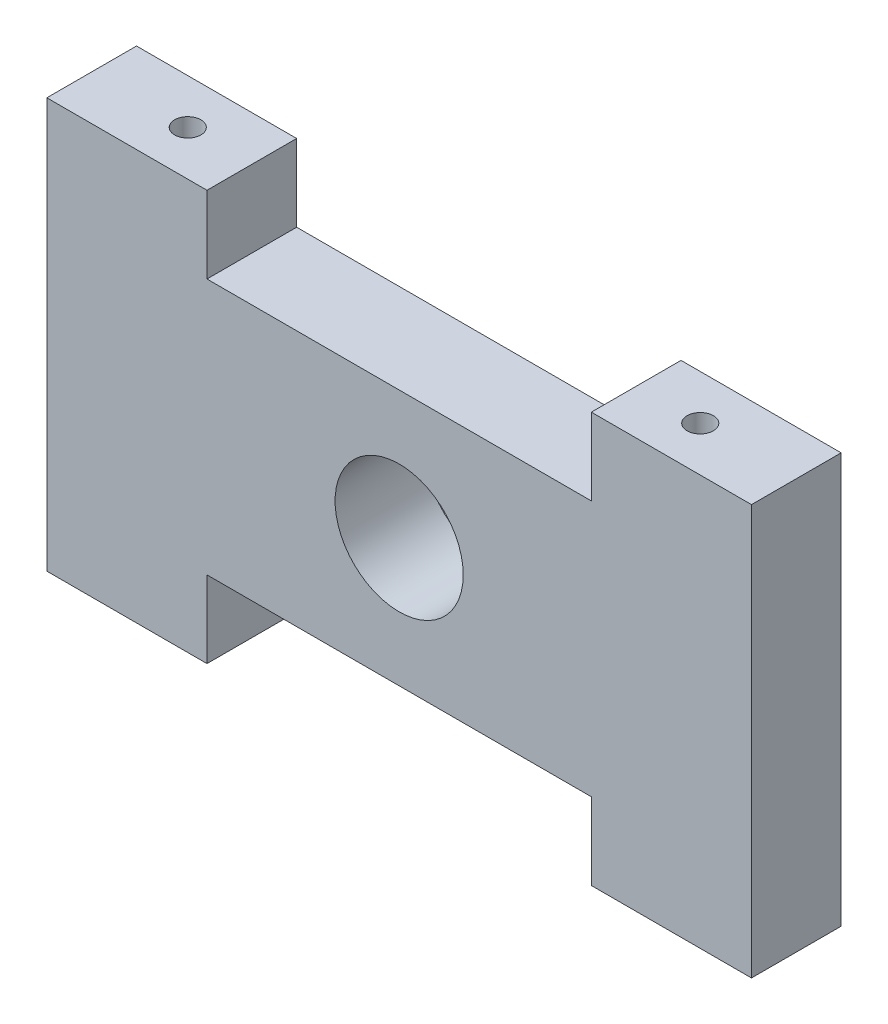
ISO-10303-21;
HEADER;
FILE_DESCRIPTION(('STEP AP214'),'2;1');
FILE_NAME('part.step','',(''),(''),'','','');
FILE_SCHEMA(('AUTOMOTIVE_DESIGN { 1 0 10303 214 1 1 1 1 }'));
ENDSEC;
DATA;
#1=APPLICATION_CONTEXT('core data for automotive mechanical design processes');
#2=APPLICATION_PROTOCOL_DEFINITION('international standard','automotive_design',2000,#1);
#3=PRODUCT_CONTEXT('',#1,'mechanical');
#4=PRODUCT('Part','Part','',(#3));
#5=PRODUCT_RELATED_PRODUCT_CATEGORY('part','',(#4));
#6=PRODUCT_DEFINITION_FORMATION('','',#4);
#7=PRODUCT_DEFINITION_CONTEXT('part definition',#1,'design');
#8=PRODUCT_DEFINITION('design','',#6,#7);
#9=PRODUCT_DEFINITION_SHAPE('','',#8);
#10=(LENGTH_UNIT() NAMED_UNIT(*) SI_UNIT(.MILLI.,.METRE.));
#11=(NAMED_UNIT(*) PLANE_ANGLE_UNIT() SI_UNIT($,.RADIAN.));
#12=(NAMED_UNIT(*) SI_UNIT($,.STERADIAN.) SOLID_ANGLE_UNIT());
#13=UNCERTAINTY_MEASURE_WITH_UNIT(LENGTH_MEASURE(1.E-05),#10,'distance_accuracy_value','');
#14=(GEOMETRIC_REPRESENTATION_CONTEXT(3) GLOBAL_UNCERTAINTY_ASSIGNED_CONTEXT((#13)) GLOBAL_UNIT_ASSIGNED_CONTEXT((#10,
#11,#12)) REPRESENTATION_CONTEXT('',''));
#15=CARTESIAN_POINT('',(0.,0.,0.));
#16=DIRECTION('',(0.,0.,1.));
#17=DIRECTION('',(1.,0.,0.));
#18=AXIS2_PLACEMENT_3D('',#15,#16,#17);
#19=CARTESIAN_POINT('',(27.5,-16.,7.));
#20=DIRECTION('',(0.,0.,-1.));
#21=DIRECTION('',(-1.,0.,0.));
#22=AXIS2_PLACEMENT_3D('',#19,#20,#21);
#23=PLANE('',#22);
#24=DIRECTION('',(1.,0.,0.));
#25=VECTOR('',#24,1.);
#26=CARTESIAN_POINT('',(15.,-16.,7.));
#27=LINE('',#26,#25);
#28=CARTESIAN_POINT('',(15.,-16.,7.));
#29=VERTEX_POINT('',#28);
#30=CARTESIAN_POINT('',(27.5,-16.,7.));
#31=VERTEX_POINT('',#30);
#32=EDGE_CURVE('E178',#29,#31,#27,.T.);
#33=ORIENTED_EDGE('',*,*,#32,.T.);
#34=DIRECTION('',(0.,1.,0.));
#35=VECTOR('',#34,1.);
#36=CARTESIAN_POINT('',(27.5,16.,7.));
#37=LINE('',#36,#35);
#38=CARTESIAN_POINT('',(27.5,16.,7.));
#39=VERTEX_POINT('',#38);
#40=EDGE_CURVE('E106',#31,#39,#37,.T.);
#41=ORIENTED_EDGE('',*,*,#40,.T.);
#42=DIRECTION('',(-1.,0.,0.));
#43=VECTOR('',#42,1.);
#44=CARTESIAN_POINT('',(15.,16.,7.));
#45=LINE('',#44,#43);
#46=CARTESIAN_POINT('',(15.,16.,7.));
#47=VERTEX_POINT('',#46);
#48=EDGE_CURVE('E205',#39,#47,#45,.T.);
#49=ORIENTED_EDGE('',*,*,#48,.T.);
#50=DIRECTION('',(0.,-1.,0.));
#51=VECTOR('',#50,1.);
#52=CARTESIAN_POINT('',(15.,10.,7.));
#53=LINE('',#52,#51);
#54=CARTESIAN_POINT('',(15.,10.,7.));
#55=VERTEX_POINT('',#54);
#56=EDGE_CURVE('E224',#47,#55,#53,.T.);
#57=ORIENTED_EDGE('',*,*,#56,.T.);
#58=DIRECTION('',(-1.,0.,0.));
#59=VECTOR('',#58,1.);
#60=CARTESIAN_POINT('',(-15.,10.,7.));
#61=LINE('',#60,#59);
#62=CARTESIAN_POINT('',(-15.,10.,7.));
#63=VERTEX_POINT('',#62);
#64=EDGE_CURVE('E221',#55,#63,#61,.T.);
#65=ORIENTED_EDGE('',*,*,#64,.T.);
#66=DIRECTION('',(0.,1.,0.));
#67=VECTOR('',#66,1.);
#68=CARTESIAN_POINT('',(-15.,10.,7.));
#69=LINE('',#68,#67);
#70=CARTESIAN_POINT('',(-15.,16.,7.));
#71=VERTEX_POINT('',#70);
#72=EDGE_CURVE('E223',#63,#71,#69,.T.);
#73=ORIENTED_EDGE('',*,*,#72,.T.);
#74=DIRECTION('',(-1.,0.,0.));
#75=VECTOR('',#74,1.);
#76=CARTESIAN_POINT('',(-27.5,16.,7.));
#77=LINE('',#76,#75);
#78=CARTESIAN_POINT('',(-27.5,16.,7.));
#79=VERTEX_POINT('',#78);
#80=EDGE_CURVE('E226',#71,#79,#77,.T.);
#81=ORIENTED_EDGE('',*,*,#80,.T.);
#82=DIRECTION('',(0.,-1.,0.));
#83=VECTOR('',#82,1.);
#84=CARTESIAN_POINT('',(-27.5,16.,7.));
#85=LINE('',#84,#83);
#86=CARTESIAN_POINT('',(-27.5,-16.,7.));
#87=VERTEX_POINT('',#86);
#88=EDGE_CURVE('E232',#79,#87,#85,.T.);
#89=ORIENTED_EDGE('',*,*,#88,.T.);
#90=DIRECTION('',(1.,0.,0.));
#91=VECTOR('',#90,1.);
#92=CARTESIAN_POINT('',(-27.5,-16.,7.));
#93=LINE('',#92,#91);
#94=CARTESIAN_POINT('',(-15.,-16.,7.));
#95=VERTEX_POINT('',#94);
#96=EDGE_CURVE('E137',#87,#95,#93,.T.);
#97=ORIENTED_EDGE('',*,*,#96,.T.);
#98=DIRECTION('',(0.,1.,0.));
#99=VECTOR('',#98,1.);
#100=CARTESIAN_POINT('',(-15.,-10.,7.));
#101=LINE('',#100,#99);
#102=CARTESIAN_POINT('',(-15.,-10.,7.));
#103=VERTEX_POINT('',#102);
#104=EDGE_CURVE('E131',#95,#103,#101,.T.);
#105=ORIENTED_EDGE('',*,*,#104,.T.);
#106=DIRECTION('',(1.,0.,0.));
#107=VECTOR('',#106,1.);
#108=CARTESIAN_POINT('',(-15.,-10.,7.));
#109=LINE('',#108,#107);
#110=CARTESIAN_POINT('',(15.,-10.,7.));
#111=VERTEX_POINT('',#110);
#112=EDGE_CURVE('E135',#103,#111,#109,.T.);
#113=ORIENTED_EDGE('',*,*,#112,.T.);
#114=DIRECTION('',(0.,-1.,0.));
#115=VECTOR('',#114,1.);
#116=CARTESIAN_POINT('',(15.,-10.,7.));
#117=LINE('',#116,#115);
#118=EDGE_CURVE('E51',#111,#29,#117,.T.);
#119=ORIENTED_EDGE('',*,*,#118,.T.);
#120=EDGE_LOOP('',(#33,#41,#49,#57,#65,#73,#81,#89,#97,#105,#113,#119));
#121=FACE_BOUND('',#120,.T.);
#122=CARTESIAN_POINT('',(0.,0.,7.));
#123=DIRECTION('',(0.,0.,1.));
#124=DIRECTION('',(1.,0.,0.));
#125=AXIS2_PLACEMENT_3D('',#122,#123,#124);
#126=CIRCLE('',#125,5.);
#127=CARTESIAN_POINT('',(5.00000000000001,0.,7.));
#128=VERTEX_POINT('',#127);
#129=EDGE_CURVE('E159',#128,#128,#126,.T.);
#130=ORIENTED_EDGE('',*,*,#129,.F.);
#131=EDGE_LOOP('',(#130));
#132=FACE_BOUND('',#131,.T.);
#133=ADVANCED_FACE('F34',(#121,#132),#23,.F.);
#134=CARTESIAN_POINT('',(27.5,-16.,0.));
#135=DIRECTION('',(0.,0.,-1.));
#136=DIRECTION('',(-1.,0.,0.));
#137=AXIS2_PLACEMENT_3D('',#134,#135,#136);
#138=PLANE('',#137);
#139=DIRECTION('',(1.,0.,0.));
#140=VECTOR('',#139,1.);
#141=CARTESIAN_POINT('',(15.,-16.,0.));
#142=LINE('',#141,#140);
#143=CARTESIAN_POINT('',(15.,-16.,0.));
#144=VERTEX_POINT('',#143);
#145=CARTESIAN_POINT('',(27.5,-16.,0.));
#146=VERTEX_POINT('',#145);
#147=EDGE_CURVE('E155',#144,#146,#142,.T.);
#148=ORIENTED_EDGE('',*,*,#147,.F.);
#149=DIRECTION('',(0.,-1.,0.));
#150=VECTOR('',#149,1.);
#151=CARTESIAN_POINT('',(15.,-10.,0.));
#152=LINE('',#151,#150);
#153=CARTESIAN_POINT('',(15.,-10.,0.));
#154=VERTEX_POINT('',#153);
#155=EDGE_CURVE('E98',#154,#144,#152,.T.);
#156=ORIENTED_EDGE('',*,*,#155,.F.);
#157=DIRECTION('',(1.,0.,0.));
#158=VECTOR('',#157,1.);
#159=CARTESIAN_POINT('',(-15.,-10.,0.));
#160=LINE('',#159,#158);
#161=CARTESIAN_POINT('',(-15.,-10.,0.));
#162=VERTEX_POINT('',#161);
#163=EDGE_CURVE('E92',#162,#154,#160,.T.);
#164=ORIENTED_EDGE('',*,*,#163,.F.);
#165=DIRECTION('',(0.,1.,0.));
#166=VECTOR('',#165,1.);
#167=CARTESIAN_POINT('',(-15.,-10.,0.));
#168=LINE('',#167,#166);
#169=CARTESIAN_POINT('',(-15.,-16.,0.));
#170=VERTEX_POINT('',#169);
#171=EDGE_CURVE('E145',#170,#162,#168,.T.);
#172=ORIENTED_EDGE('',*,*,#171,.F.);
#173=DIRECTION('',(1.,0.,0.));
#174=VECTOR('',#173,1.);
#175=CARTESIAN_POINT('',(-27.5,-16.,0.));
#176=LINE('',#175,#174);
#177=CARTESIAN_POINT('',(-27.5,-16.,0.));
#178=VERTEX_POINT('',#177);
#179=EDGE_CURVE('E173',#178,#170,#176,.T.);
#180=ORIENTED_EDGE('',*,*,#179,.F.);
#181=DIRECTION('',(0.,-1.,0.));
#182=VECTOR('',#181,1.);
#183=CARTESIAN_POINT('',(-27.5,16.,0.));
#184=LINE('',#183,#182);
#185=CARTESIAN_POINT('',(-27.5,16.,0.));
#186=VERTEX_POINT('',#185);
#187=EDGE_CURVE('E171',#186,#178,#184,.T.);
#188=ORIENTED_EDGE('',*,*,#187,.F.);
#189=DIRECTION('',(-1.,0.,0.));
#190=VECTOR('',#189,1.);
#191=CARTESIAN_POINT('',(-27.5,16.,0.));
#192=LINE('',#191,#190);
#193=CARTESIAN_POINT('',(-15.,16.,0.));
#194=VERTEX_POINT('',#193);
#195=EDGE_CURVE('E169',#194,#186,#192,.T.);
#196=ORIENTED_EDGE('',*,*,#195,.F.);
#197=DIRECTION('',(0.,1.,0.));
#198=VECTOR('',#197,1.);
#199=CARTESIAN_POINT('',(-15.,10.,0.));
#200=LINE('',#199,#198);
#201=CARTESIAN_POINT('',(-15.,10.,0.));
#202=VERTEX_POINT('',#201);
#203=EDGE_CURVE('E167',#202,#194,#200,.T.);
#204=ORIENTED_EDGE('',*,*,#203,.F.);
#205=DIRECTION('',(-1.,0.,0.));
#206=VECTOR('',#205,1.);
#207=CARTESIAN_POINT('',(-15.,10.,0.));
#208=LINE('',#207,#206);
#209=CARTESIAN_POINT('',(15.,10.,0.));
#210=VERTEX_POINT('',#209);
#211=EDGE_CURVE('E165',#210,#202,#208,.T.);
#212=ORIENTED_EDGE('',*,*,#211,.F.);
#213=DIRECTION('',(0.,-1.,0.));
#214=VECTOR('',#213,1.);
#215=CARTESIAN_POINT('',(15.,10.,0.));
#216=LINE('',#215,#214);
#217=CARTESIAN_POINT('',(15.,16.,0.));
#218=VERTEX_POINT('',#217);
#219=EDGE_CURVE('E163',#218,#210,#216,.T.);
#220=ORIENTED_EDGE('',*,*,#219,.F.);
#221=DIRECTION('',(-1.,0.,0.));
#222=VECTOR('',#221,1.);
#223=CARTESIAN_POINT('',(15.,16.,0.));
#224=LINE('',#223,#222);
#225=CARTESIAN_POINT('',(27.5,16.,0.));
#226=VERTEX_POINT('',#225);
#227=EDGE_CURVE('E161',#226,#218,#224,.T.);
#228=ORIENTED_EDGE('',*,*,#227,.F.);
#229=DIRECTION('',(0.,1.,0.));
#230=VECTOR('',#229,1.);
#231=CARTESIAN_POINT('',(27.5,16.,0.));
#232=LINE('',#231,#230);
#233=EDGE_CURVE('E158',#146,#226,#232,.T.);
#234=ORIENTED_EDGE('',*,*,#233,.F.);
#235=EDGE_LOOP('',(#148,#156,#164,#172,#180,#188,#196,#204,#212,#220,#228,#234));
#236=FACE_BOUND('',#235,.T.);
#237=CARTESIAN_POINT('',(0.,0.,0.));
#238=DIRECTION('',(0.,0.,1.));
#239=DIRECTION('',(1.,0.,0.));
#240=AXIS2_PLACEMENT_3D('',#237,#238,#239);
#241=CIRCLE('',#240,5.);
#242=CARTESIAN_POINT('',(5.00000000000001,0.,0.));
#243=VERTEX_POINT('',#242);
#244=EDGE_CURVE('E290',#243,#243,#241,.T.);
#245=ORIENTED_EDGE('',*,*,#244,.T.);
#246=EDGE_LOOP('',(#245));
#247=FACE_BOUND('',#246,.T.);
#248=ADVANCED_FACE('F209',(#236,#247),#138,.T.);
#249=CARTESIAN_POINT('',(15.,-16.,7.));
#250=DIRECTION('',(0.,1.,0.));
#251=DIRECTION('',(0.,0.,1.));
#252=AXIS2_PLACEMENT_3D('',#249,#250,#251);
#253=PLANE('',#252);
#254=CARTESIAN_POINT('',(20.,-16.,3.5));
#255=DIRECTION('',(0.,1.,0.));
#256=DIRECTION('',(0.,0.,1.));
#257=AXIS2_PLACEMENT_3D('',#254,#255,#256);
#258=CIRCLE('',#257,1.02499999999999);
#259=CARTESIAN_POINT('',(20.,-16.,4.52499999999999));
#260=VERTEX_POINT('',#259);
#261=EDGE_CURVE('E287',#260,#260,#258,.T.);
#262=ORIENTED_EDGE('',*,*,#261,.T.);
#263=EDGE_LOOP('',(#262));
#264=FACE_BOUND('',#263,.T.);
#265=ORIENTED_EDGE('',*,*,#147,.T.);
#266=DIRECTION('',(0.,0.,-1.));
#267=VECTOR('',#266,1.);
#268=CARTESIAN_POINT('',(27.5,-16.,7.));
#269=LINE('',#268,#267);
#270=EDGE_CURVE('E11',#31,#146,#269,.T.);
#271=ORIENTED_EDGE('',*,*,#270,.F.);
#272=ORIENTED_EDGE('',*,*,#32,.F.);
#273=DIRECTION('',(0.,0.,-1.));
#274=VECTOR('',#273,1.);
#275=CARTESIAN_POINT('',(15.,-16.,7.));
#276=LINE('',#275,#274);
#277=EDGE_CURVE('E151',#29,#144,#276,.T.);
#278=ORIENTED_EDGE('',*,*,#277,.T.);
#279=EDGE_LOOP('',(#265,#271,#272,#278));
#280=FACE_BOUND('',#279,.T.);
#281=ADVANCED_FACE('F36',(#264,#280),#253,.F.);
#282=CARTESIAN_POINT('',(27.5,16.,7.));
#283=DIRECTION('',(-1.,0.,0.));
#284=DIRECTION('',(0.,-1.,0.));
#285=AXIS2_PLACEMENT_3D('',#282,#283,#284);
#286=PLANE('',#285);
#287=ORIENTED_EDGE('',*,*,#233,.T.);
#288=DIRECTION('',(0.,0.,-1.));
#289=VECTOR('',#288,1.);
#290=CARTESIAN_POINT('',(27.5,16.,7.));
#291=LINE('',#290,#289);
#292=EDGE_CURVE('E43',#39,#226,#291,.T.);
#293=ORIENTED_EDGE('',*,*,#292,.F.);
#294=ORIENTED_EDGE('',*,*,#40,.F.);
#295=ORIENTED_EDGE('',*,*,#270,.T.);
#296=EDGE_LOOP('',(#287,#293,#294,#295));
#297=FACE_BOUND('',#296,.T.);
#298=ADVANCED_FACE('F305',(#297),#286,.F.);
#299=CARTESIAN_POINT('',(15.,16.,7.));
#300=DIRECTION('',(0.,-1.,0.));
#301=DIRECTION('',(0.,0.,-1.));
#302=AXIS2_PLACEMENT_3D('',#299,#300,#301);
#303=PLANE('',#302);
#304=CARTESIAN_POINT('',(20.,16.,3.5));
#305=DIRECTION('',(0.,1.,0.));
#306=DIRECTION('',(0.,0.,1.));
#307=AXIS2_PLACEMENT_3D('',#304,#305,#306);
#308=CIRCLE('',#307,1.02499999999999);
#309=CARTESIAN_POINT('',(20.,16.,4.52499999999999));
#310=VERTEX_POINT('',#309);
#311=EDGE_CURVE('E282',#310,#310,#308,.T.);
#312=ORIENTED_EDGE('',*,*,#311,.F.);
#313=EDGE_LOOP('',(#312));
#314=FACE_BOUND('',#313,.T.);
#315=ORIENTED_EDGE('',*,*,#227,.T.);
#316=DIRECTION('',(0.,0.,-1.));
#317=VECTOR('',#316,1.);
#318=CARTESIAN_POINT('',(15.,16.,7.));
#319=LINE('',#318,#317);
#320=EDGE_CURVE('E197',#47,#218,#319,.T.);
#321=ORIENTED_EDGE('',*,*,#320,.F.);
#322=ORIENTED_EDGE('',*,*,#48,.F.);
#323=ORIENTED_EDGE('',*,*,#292,.T.);
#324=EDGE_LOOP('',(#315,#321,#322,#323));
#325=FACE_BOUND('',#324,.T.);
#326=ADVANCED_FACE('F203',(#314,#325),#303,.F.);
#327=CARTESIAN_POINT('',(15.,10.,7.));
#328=DIRECTION('',(1.,0.,0.));
#329=DIRECTION('',(0.,1.,0.));
#330=AXIS2_PLACEMENT_3D('',#327,#328,#329);
#331=PLANE('',#330);
#332=ORIENTED_EDGE('',*,*,#219,.T.);
#333=DIRECTION('',(0.,0.,-1.));
#334=VECTOR('',#333,1.);
#335=CARTESIAN_POINT('',(15.,10.,7.));
#336=LINE('',#335,#334);
#337=EDGE_CURVE('E194',#55,#210,#336,.T.);
#338=ORIENTED_EDGE('',*,*,#337,.F.);
#339=ORIENTED_EDGE('',*,*,#56,.F.);
#340=ORIENTED_EDGE('',*,*,#320,.T.);
#341=EDGE_LOOP('',(#332,#338,#339,#340));
#342=FACE_BOUND('',#341,.T.);
#343=ADVANCED_FACE('F215',(#342),#331,.F.);
#344=CARTESIAN_POINT('',(-15.,10.,7.));
#345=DIRECTION('',(0.,-1.,0.));
#346=DIRECTION('',(0.,0.,-1.));
#347=AXIS2_PLACEMENT_3D('',#344,#345,#346);
#348=PLANE('',#347);
#349=ORIENTED_EDGE('',*,*,#211,.T.);
#350=DIRECTION('',(0.,0.,-1.));
#351=VECTOR('',#350,1.);
#352=CARTESIAN_POINT('',(-15.,10.,7.));
#353=LINE('',#352,#351);
#354=EDGE_CURVE('E191',#63,#202,#353,.T.);
#355=ORIENTED_EDGE('',*,*,#354,.F.);
#356=ORIENTED_EDGE('',*,*,#64,.F.);
#357=ORIENTED_EDGE('',*,*,#337,.T.);
#358=EDGE_LOOP('',(#349,#355,#356,#357));
#359=FACE_BOUND('',#358,.T.);
#360=ADVANCED_FACE('F219',(#359),#348,.F.);
#361=CARTESIAN_POINT('',(-15.,10.,7.));
#362=DIRECTION('',(-1.,0.,0.));
#363=DIRECTION('',(0.,0.,1.));
#364=AXIS2_PLACEMENT_3D('',#361,#362,#363);
#365=PLANE('',#364);
#366=ORIENTED_EDGE('',*,*,#203,.T.);
#367=DIRECTION('',(0.,0.,-1.));
#368=VECTOR('',#367,1.);
#369=CARTESIAN_POINT('',(-15.,16.,7.));
#370=LINE('',#369,#368);
#371=EDGE_CURVE('E188',#71,#194,#370,.T.);
#372=ORIENTED_EDGE('',*,*,#371,.F.);
#373=ORIENTED_EDGE('',*,*,#72,.F.);
#374=ORIENTED_EDGE('',*,*,#354,.T.);
#375=EDGE_LOOP('',(#366,#372,#373,#374));
#376=FACE_BOUND('',#375,.T.);
#377=ADVANCED_FACE('F315',(#376),#365,.F.);
#378=CARTESIAN_POINT('',(-27.5,16.,7.));
#379=DIRECTION('',(0.,-1.,0.));
#380=DIRECTION('',(0.,0.,-1.));
#381=AXIS2_PLACEMENT_3D('',#378,#379,#380);
#382=PLANE('',#381);
#383=CARTESIAN_POINT('',(-20.,16.,3.5));
#384=DIRECTION('',(0.,1.,0.));
#385=DIRECTION('',(0.,0.,1.));
#386=AXIS2_PLACEMENT_3D('',#383,#384,#385);
#387=CIRCLE('',#386,1.02499999999999);
#388=CARTESIAN_POINT('',(-20.,16.,4.52499999999999));
#389=VERTEX_POINT('',#388);
#390=EDGE_CURVE('E279',#389,#389,#387,.T.);
#391=ORIENTED_EDGE('',*,*,#390,.F.);
#392=EDGE_LOOP('',(#391));
#393=FACE_BOUND('',#392,.T.);
#394=ORIENTED_EDGE('',*,*,#195,.T.);
#395=DIRECTION('',(0.,0.,-1.));
#396=VECTOR('',#395,1.);
#397=CARTESIAN_POINT('',(-27.5,16.,7.));
#398=LINE('',#397,#396);
#399=EDGE_CURVE('E185',#79,#186,#398,.T.);
#400=ORIENTED_EDGE('',*,*,#399,.F.);
#401=ORIENTED_EDGE('',*,*,#80,.F.);
#402=ORIENTED_EDGE('',*,*,#371,.T.);
#403=EDGE_LOOP('',(#394,#400,#401,#402));
#404=FACE_BOUND('',#403,.T.);
#405=ADVANCED_FACE('F318',(#393,#404),#382,.F.);
#406=CARTESIAN_POINT('',(-27.5,16.,7.));
#407=DIRECTION('',(1.,0.,0.));
#408=DIRECTION('',(0.,1.,0.));
#409=AXIS2_PLACEMENT_3D('',#406,#407,#408);
#410=PLANE('',#409);
#411=ORIENTED_EDGE('',*,*,#187,.T.);
#412=DIRECTION('',(0.,0.,-1.));
#413=VECTOR('',#412,1.);
#414=CARTESIAN_POINT('',(-27.5,-16.,7.));
#415=LINE('',#414,#413);
#416=EDGE_CURVE('E182',#87,#178,#415,.T.);
#417=ORIENTED_EDGE('',*,*,#416,.F.);
#418=ORIENTED_EDGE('',*,*,#88,.F.);
#419=ORIENTED_EDGE('',*,*,#399,.T.);
#420=EDGE_LOOP('',(#411,#417,#418,#419));
#421=FACE_BOUND('',#420,.T.);
#422=ADVANCED_FACE('F238',(#421),#410,.F.);
#423=CARTESIAN_POINT('',(-27.5,-16.,7.));
#424=DIRECTION('',(0.,1.,0.));
#425=DIRECTION('',(0.,0.,1.));
#426=AXIS2_PLACEMENT_3D('',#423,#424,#425);
#427=PLANE('',#426);
#428=CARTESIAN_POINT('',(-20.,-16.,3.5));
#429=DIRECTION('',(0.,1.,0.));
#430=DIRECTION('',(0.,0.,1.));
#431=AXIS2_PLACEMENT_3D('',#428,#429,#430);
#432=CIRCLE('',#431,1.02499999999999);
#433=CARTESIAN_POINT('',(-20.,-16.,4.52499999999999));
#434=VERTEX_POINT('',#433);
#435=EDGE_CURVE('E276',#434,#434,#432,.T.);
#436=ORIENTED_EDGE('',*,*,#435,.T.);
#437=EDGE_LOOP('',(#436));
#438=FACE_BOUND('',#437,.T.);
#439=ORIENTED_EDGE('',*,*,#179,.T.);
#440=DIRECTION('',(0.,0.,-1.));
#441=VECTOR('',#440,1.);
#442=CARTESIAN_POINT('',(-15.,-16.,7.));
#443=LINE('',#442,#441);
#444=EDGE_CURVE('E146',#95,#170,#443,.T.);
#445=ORIENTED_EDGE('',*,*,#444,.F.);
#446=ORIENTED_EDGE('',*,*,#96,.F.);
#447=ORIENTED_EDGE('',*,*,#416,.T.);
#448=EDGE_LOOP('',(#439,#445,#446,#447));
#449=FACE_BOUND('',#448,.T.);
#450=ADVANCED_FACE('F242',(#438,#449),#427,.F.);
#451=CARTESIAN_POINT('',(-15.,-10.,7.));
#452=DIRECTION('',(-1.,0.,0.));
#453=DIRECTION('',(0.,0.,1.));
#454=AXIS2_PLACEMENT_3D('',#451,#452,#453);
#455=PLANE('',#454);
#456=ORIENTED_EDGE('',*,*,#171,.T.);
#457=DIRECTION('',(0.,0.,-1.));
#458=VECTOR('',#457,1.);
#459=CARTESIAN_POINT('',(-15.,-10.,7.));
#460=LINE('',#459,#458);
#461=EDGE_CURVE('E142',#103,#162,#460,.T.);
#462=ORIENTED_EDGE('',*,*,#461,.F.);
#463=ORIENTED_EDGE('',*,*,#104,.F.);
#464=ORIENTED_EDGE('',*,*,#444,.T.);
#465=EDGE_LOOP('',(#456,#462,#463,#464));
#466=FACE_BOUND('',#465,.T.);
#467=ADVANCED_FACE('F143',(#466),#455,.F.);
#468=CARTESIAN_POINT('',(-15.,-10.,7.));
#469=DIRECTION('',(0.,1.,0.));
#470=DIRECTION('',(0.,0.,1.));
#471=AXIS2_PLACEMENT_3D('',#468,#469,#470);
#472=PLANE('',#471);
#473=ORIENTED_EDGE('',*,*,#163,.T.);
#474=DIRECTION('',(0.,0.,-1.));
#475=VECTOR('',#474,1.);
#476=CARTESIAN_POINT('',(15.,-10.,7.));
#477=LINE('',#476,#475);
#478=EDGE_CURVE('E147',#111,#154,#477,.T.);
#479=ORIENTED_EDGE('',*,*,#478,.F.);
#480=ORIENTED_EDGE('',*,*,#112,.F.);
#481=ORIENTED_EDGE('',*,*,#461,.T.);
#482=EDGE_LOOP('',(#473,#479,#480,#481));
#483=FACE_BOUND('',#482,.T.);
#484=ADVANCED_FACE('F149',(#483),#472,.F.);
#485=CARTESIAN_POINT('',(15.,-10.,7.));
#486=DIRECTION('',(1.,0.,0.));
#487=DIRECTION('',(0.,1.,0.));
#488=AXIS2_PLACEMENT_3D('',#485,#486,#487);
#489=PLANE('',#488);
#490=ORIENTED_EDGE('',*,*,#155,.T.);
#491=ORIENTED_EDGE('',*,*,#277,.F.);
#492=ORIENTED_EDGE('',*,*,#118,.F.);
#493=ORIENTED_EDGE('',*,*,#478,.T.);
#494=EDGE_LOOP('',(#490,#491,#492,#493));
#495=FACE_BOUND('',#494,.T.);
#496=ADVANCED_FACE('F246',(#495),#489,.F.);
#497=CARTESIAN_POINT('',(0.,0.,7.));
#498=DIRECTION('',(0.,0.,-1.));
#499=DIRECTION('',(-1.,0.,0.));
#500=AXIS2_PLACEMENT_3D('',#497,#498,#499);
#501=CYLINDRICAL_SURFACE('',#500,5.);
#502=ORIENTED_EDGE('',*,*,#129,.T.);
#503=EDGE_LOOP('',(#502));
#504=FACE_BOUND('',#503,.T.);
#505=ORIENTED_EDGE('',*,*,#244,.F.);
#506=EDGE_LOOP('',(#505));
#507=FACE_BOUND('',#506,.T.);
#508=ADVANCED_FACE('F248',(#504,#507),#501,.F.);
#509=CARTESIAN_POINT('',(20.,16.,3.5));
#510=DIRECTION('',(0.,1.,0.));
#511=DIRECTION('',(0.,0.,1.));
#512=AXIS2_PLACEMENT_3D('',#509,#510,#511);
#513=CYLINDRICAL_SURFACE('',#512,1.02499999999999);
#514=ORIENTED_EDGE('',*,*,#261,.F.);
#515=EDGE_LOOP('',(#514));
#516=FACE_BOUND('',#515,.T.);
#517=ORIENTED_EDGE('',*,*,#311,.T.);
#518=EDGE_LOOP('',(#517));
#519=FACE_BOUND('',#518,.T.);
#520=ADVANCED_FACE('F254',(#516,#519),#513,.F.);
#521=CARTESIAN_POINT('',(-20.,16.,3.5));
#522=DIRECTION('',(0.,1.,0.));
#523=DIRECTION('',(0.,0.,1.));
#524=AXIS2_PLACEMENT_3D('',#521,#522,#523);
#525=CYLINDRICAL_SURFACE('',#524,1.02499999999999);
#526=ORIENTED_EDGE('',*,*,#435,.F.);
#527=EDGE_LOOP('',(#526));
#528=FACE_BOUND('',#527,.T.);
#529=ORIENTED_EDGE('',*,*,#390,.T.);
#530=EDGE_LOOP('',(#529));
#531=FACE_BOUND('',#530,.T.);
#532=ADVANCED_FACE('F267',(#528,#531),#525,.F.);
#533=CLOSED_SHELL('',(#133,#248,#281,#298,#326,#343,#360,#377,#405,#422,#450,#467,#484,#496,
#508,#520,#532));
#534=MANIFOLD_SOLID_BREP('B2',#533);
#535=ADVANCED_BREP_SHAPE_REPRESENTATION('',(#18,#534),#14);
#536=SHAPE_DEFINITION_REPRESENTATION(#9,#535);
ENDSEC;
END-ISO-10303-21;
